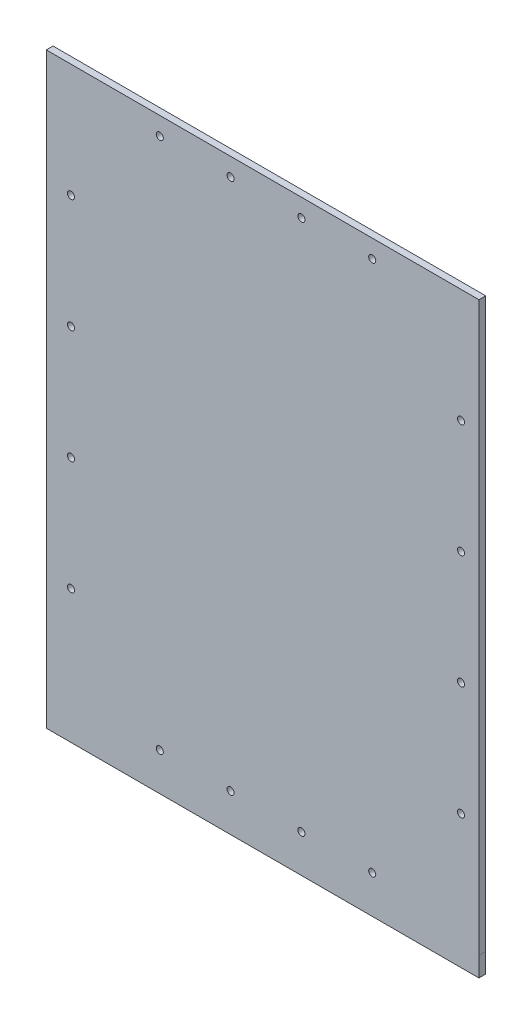
ISO-10303-21;
HEADER;
FILE_DESCRIPTION(('STEP AP214'),'2;1');
FILE_NAME('part.step','',(''),(''),'','','');
FILE_SCHEMA(('AUTOMOTIVE_DESIGN { 1 0 10303 214 1 1 1 1 }'));
ENDSEC;
DATA;
#1=APPLICATION_CONTEXT('core data for automotive mechanical design processes');
#2=APPLICATION_PROTOCOL_DEFINITION('international standard','automotive_design',2000,#1);
#3=PRODUCT_CONTEXT('',#1,'mechanical');
#4=PRODUCT('Part','Part','',(#3));
#5=PRODUCT_RELATED_PRODUCT_CATEGORY('part','',(#4));
#6=PRODUCT_DEFINITION_FORMATION('','',#4);
#7=PRODUCT_DEFINITION_CONTEXT('part definition',#1,'design');
#8=PRODUCT_DEFINITION('design','',#6,#7);
#9=PRODUCT_DEFINITION_SHAPE('','',#8);
#10=(LENGTH_UNIT() NAMED_UNIT(*) SI_UNIT(.MILLI.,.METRE.));
#11=(NAMED_UNIT(*) PLANE_ANGLE_UNIT() SI_UNIT($,.RADIAN.));
#12=(NAMED_UNIT(*) SI_UNIT($,.STERADIAN.) SOLID_ANGLE_UNIT());
#13=UNCERTAINTY_MEASURE_WITH_UNIT(LENGTH_MEASURE(1.E-05),#10,'distance_accuracy_value','');
#14=(GEOMETRIC_REPRESENTATION_CONTEXT(3) GLOBAL_UNCERTAINTY_ASSIGNED_CONTEXT((#13)) GLOBAL_UNIT_ASSIGNED_CONTEXT((#10,
#11,#12)) REPRESENTATION_CONTEXT('',''));
#15=CARTESIAN_POINT('',(0.,0.,0.));
#16=DIRECTION('',(0.,0.,1.));
#17=DIRECTION('',(1.,0.,0.));
#18=AXIS2_PLACEMENT_3D('',#15,#16,#17);
#19=CARTESIAN_POINT('',(-152.775,198.025,-0.00999999999999959));
#20=DIRECTION('',(0.,-1.,0.));
#21=DIRECTION('',(0.,0.,-1.));
#22=AXIS2_PLACEMENT_3D('',#19,#20,#21);
#23=PLANE('',#22);
#24=DIRECTION('',(0.,0.,-1.));
#25=VECTOR('',#24,1.);
#26=CARTESIAN_POINT('',(-152.775,198.025,4.75));
#27=LINE('',#26,#25);
#28=CARTESIAN_POINT('',(-152.775,198.025,4.75));
#29=VERTEX_POINT('',#28);
#30=CARTESIAN_POINT('',(-152.775,198.025,0.));
#31=VERTEX_POINT('',#30);
#32=EDGE_CURVE('E41',#29,#31,#27,.T.);
#33=ORIENTED_EDGE('',*,*,#32,.F.);
#34=DIRECTION('',(1.,0.,0.));
#35=VECTOR('',#34,1.);
#36=CARTESIAN_POINT('',(0.,198.025,4.75));
#37=LINE('',#36,#35);
#38=CARTESIAN_POINT('',(152.775,198.025,4.75));
#39=VERTEX_POINT('',#38);
#40=EDGE_CURVE('E11',#29,#39,#37,.T.);
#41=ORIENTED_EDGE('',*,*,#40,.T.);
#42=DIRECTION('',(0.,0.,1.));
#43=VECTOR('',#42,1.);
#44=CARTESIAN_POINT('',(152.775,198.025,-0.00999999999999959));
#45=LINE('',#44,#43);
#46=CARTESIAN_POINT('',(152.775,198.025,0.));
#47=VERTEX_POINT('',#46);
#48=EDGE_CURVE('E36',#47,#39,#45,.T.);
#49=ORIENTED_EDGE('',*,*,#48,.F.);
#50=DIRECTION('',(1.,0.,0.));
#51=VECTOR('',#50,1.);
#52=CARTESIAN_POINT('',(0.,198.025,0.));
#53=LINE('',#52,#51);
#54=EDGE_CURVE('E202',#31,#47,#53,.T.);
#55=ORIENTED_EDGE('',*,*,#54,.F.);
#56=EDGE_LOOP('',(#33,#41,#49,#55));
#57=FACE_BOUND('',#56,.T.);
#58=ADVANCED_FACE('F33',(#57),#23,.F.);
#59=CARTESIAN_POINT('',(152.775,-202.775,4.75));
#60=DIRECTION('',(0.,1.,0.));
#61=DIRECTION('',(-1.,0.,0.));
#62=AXIS2_PLACEMENT_3D('',#59,#60,#61);
#63=PLANE('',#62);
#64=DIRECTION('',(1.,0.,0.));
#65=VECTOR('',#64,1.);
#66=CARTESIAN_POINT('',(152.775,-202.775,4.75));
#67=LINE('',#66,#65);
#68=CARTESIAN_POINT('',(152.725,-202.775,4.75));
#69=VERTEX_POINT('',#68);
#70=CARTESIAN_POINT('',(152.775,-202.775,4.75));
#71=VERTEX_POINT('',#70);
#72=EDGE_CURVE('E95',#69,#71,#67,.T.);
#73=ORIENTED_EDGE('',*,*,#72,.F.);
#74=DIRECTION('',(0.,0.,-1.));
#75=VECTOR('',#74,1.);
#76=CARTESIAN_POINT('',(152.725,-202.775,4.75));
#77=LINE('',#76,#75);
#78=CARTESIAN_POINT('',(152.725,-202.775,0.));
#79=VERTEX_POINT('',#78);
#80=EDGE_CURVE('E115',#69,#79,#77,.T.);
#81=ORIENTED_EDGE('',*,*,#80,.T.);
#82=DIRECTION('',(1.,0.,0.));
#83=VECTOR('',#82,1.);
#84=CARTESIAN_POINT('',(152.775,-202.775,0.));
#85=LINE('',#84,#83);
#86=CARTESIAN_POINT('',(152.775,-202.775,0.));
#87=VERTEX_POINT('',#86);
#88=EDGE_CURVE('E195',#79,#87,#85,.T.);
#89=ORIENTED_EDGE('',*,*,#88,.T.);
#90=DIRECTION('',(0.,0.,-1.));
#91=VECTOR('',#90,1.);
#92=CARTESIAN_POINT('',(152.775,-202.775,4.75));
#93=LINE('',#92,#91);
#94=EDGE_CURVE('E193',#71,#87,#93,.T.);
#95=ORIENTED_EDGE('',*,*,#94,.F.);
#96=EDGE_LOOP('',(#73,#81,#89,#95));
#97=FACE_BOUND('',#96,.T.);
#98=ADVANCED_FACE('F232',(#97),#63,.F.);
#99=CARTESIAN_POINT('',(152.775,-202.775,4.75));
#100=DIRECTION('',(-1.,0.,0.));
#101=DIRECTION('',(0.,0.,1.));
#102=AXIS2_PLACEMENT_3D('',#99,#100,#101);
#103=PLANE('',#102);
#104=DIRECTION('',(0.,1.,0.));
#105=VECTOR('',#104,1.);
#106=CARTESIAN_POINT('',(152.775,-202.775,0.));
#107=LINE('',#106,#105);
#108=EDGE_CURVE('E96',#87,#47,#107,.T.);
#109=ORIENTED_EDGE('',*,*,#108,.T.);
#110=ORIENTED_EDGE('',*,*,#48,.T.);
#111=DIRECTION('',(0.,1.,0.));
#112=VECTOR('',#111,1.);
#113=CARTESIAN_POINT('',(152.775,-202.775,4.75));
#114=LINE('',#113,#112);
#115=EDGE_CURVE('E191',#71,#39,#114,.T.);
#116=ORIENTED_EDGE('',*,*,#115,.F.);
#117=ORIENTED_EDGE('',*,*,#94,.T.);
#118=EDGE_LOOP('',(#109,#110,#116,#117));
#119=FACE_BOUND('',#118,.T.);
#120=ADVANCED_FACE('F226',(#119),#103,.F.);
#121=CARTESIAN_POINT('',(-152.775,-202.775,4.75));
#122=DIRECTION('',(1.,0.,0.));
#123=DIRECTION('',(0.,0.,-1.));
#124=AXIS2_PLACEMENT_3D('',#121,#122,#123);
#125=PLANE('',#124);
#126=DIRECTION('',(0.,-1.,0.));
#127=VECTOR('',#126,1.);
#128=CARTESIAN_POINT('',(-152.775,-202.775,4.75));
#129=LINE('',#128,#127);
#130=CARTESIAN_POINT('',(-152.775,-216.775,4.75));
#131=VERTEX_POINT('',#130);
#132=EDGE_CURVE('E86',#29,#131,#129,.T.);
#133=ORIENTED_EDGE('',*,*,#132,.F.);
#134=ORIENTED_EDGE('',*,*,#32,.T.);
#135=DIRECTION('',(0.,-1.,0.));
#136=VECTOR('',#135,1.);
#137=CARTESIAN_POINT('',(-152.775,-202.775,0.));
#138=LINE('',#137,#136);
#139=CARTESIAN_POINT('',(-152.775,-216.775,0.));
#140=VERTEX_POINT('',#139);
#141=EDGE_CURVE('E108',#31,#140,#138,.T.);
#142=ORIENTED_EDGE('',*,*,#141,.T.);
#143=DIRECTION('',(0.,0.,-1.));
#144=VECTOR('',#143,1.);
#145=CARTESIAN_POINT('',(-152.775,-216.775,4.75));
#146=LINE('',#145,#144);
#147=EDGE_CURVE('E101',#131,#140,#146,.T.);
#148=ORIENTED_EDGE('',*,*,#147,.F.);
#149=EDGE_LOOP('',(#133,#134,#142,#148));
#150=FACE_BOUND('',#149,.T.);
#151=ADVANCED_FACE('F106',(#150),#125,.F.);
#152=CARTESIAN_POINT('',(140.075,37.705,-5.25));
#153=DIRECTION('',(0.,0.,1.));
#154=DIRECTION('',(1.,0.,0.));
#155=AXIS2_PLACEMENT_3D('',#152,#153,#154);
#156=CYLINDRICAL_SURFACE('',#155,2.5);
#157=CARTESIAN_POINT('',(140.075,37.705,4.75));
#158=DIRECTION('',(0.,0.,1.));
#159=DIRECTION('',(1.,0.,0.));
#160=AXIS2_PLACEMENT_3D('',#157,#158,#159);
#161=CIRCLE('',#160,2.5);
#162=CARTESIAN_POINT('',(142.575,37.705,4.75));
#163=VERTEX_POINT('',#162);
#164=EDGE_CURVE('E179',#163,#163,#161,.T.);
#165=ORIENTED_EDGE('',*,*,#164,.T.);
#166=EDGE_LOOP('',(#165));
#167=FACE_BOUND('',#166,.T.);
#168=CARTESIAN_POINT('',(140.075,37.705,0.));
#169=DIRECTION('',(0.,0.,1.));
#170=DIRECTION('',(1.,0.,0.));
#171=AXIS2_PLACEMENT_3D('',#168,#169,#170);
#172=CIRCLE('',#171,2.5);
#173=CARTESIAN_POINT('',(142.575,37.705,0.));
#174=VERTEX_POINT('',#173);
#175=EDGE_CURVE('E188',#174,#174,#172,.T.);
#176=ORIENTED_EDGE('',*,*,#175,.F.);
#177=EDGE_LOOP('',(#176));
#178=FACE_BOUND('',#177,.T.);
#179=ADVANCED_FACE('F263',(#167,#178),#156,.F.);
#180=CARTESIAN_POINT('',(140.075,117.865,-5.25));
#181=DIRECTION('',(0.,0.,1.));
#182=DIRECTION('',(1.,0.,0.));
#183=AXIS2_PLACEMENT_3D('',#180,#181,#182);
#184=CYLINDRICAL_SURFACE('',#183,2.5);
#185=CARTESIAN_POINT('',(140.075,117.865,4.75));
#186=DIRECTION('',(0.,0.,1.));
#187=DIRECTION('',(1.,0.,0.));
#188=AXIS2_PLACEMENT_3D('',#185,#186,#187);
#189=CIRCLE('',#188,2.5);
#190=CARTESIAN_POINT('',(142.575,117.865,4.75));
#191=VERTEX_POINT('',#190);
#192=EDGE_CURVE('E176',#191,#191,#189,.T.);
#193=ORIENTED_EDGE('',*,*,#192,.T.);
#194=EDGE_LOOP('',(#193));
#195=FACE_BOUND('',#194,.T.);
#196=CARTESIAN_POINT('',(140.075,117.865,0.));
#197=DIRECTION('',(0.,0.,1.));
#198=DIRECTION('',(1.,0.,0.));
#199=AXIS2_PLACEMENT_3D('',#196,#197,#198);
#200=CIRCLE('',#199,2.5);
#201=CARTESIAN_POINT('',(142.575,117.865,0.));
#202=VERTEX_POINT('',#201);
#203=EDGE_CURVE('E205',#202,#202,#200,.T.);
#204=ORIENTED_EDGE('',*,*,#203,.F.);
#205=EDGE_LOOP('',(#204));
#206=FACE_BOUND('',#205,.T.);
#207=ADVANCED_FACE('F270',(#195,#206),#184,.F.);
#208=CARTESIAN_POINT('',(140.075,-42.455,-5.25));
#209=DIRECTION('',(0.,0.,1.));
#210=DIRECTION('',(1.,0.,0.));
#211=AXIS2_PLACEMENT_3D('',#208,#209,#210);
#212=CYLINDRICAL_SURFACE('',#211,2.5);
#213=CARTESIAN_POINT('',(140.075,-42.455,4.75));
#214=DIRECTION('',(0.,0.,1.));
#215=DIRECTION('',(1.,0.,0.));
#216=AXIS2_PLACEMENT_3D('',#213,#214,#215);
#217=CIRCLE('',#216,2.5);
#218=CARTESIAN_POINT('',(142.575,-42.455,4.75));
#219=VERTEX_POINT('',#218);
#220=EDGE_CURVE('E180',#219,#219,#217,.T.);
#221=ORIENTED_EDGE('',*,*,#220,.T.);
#222=EDGE_LOOP('',(#221));
#223=FACE_BOUND('',#222,.T.);
#224=CARTESIAN_POINT('',(140.075,-42.455,0.));
#225=DIRECTION('',(0.,0.,1.));
#226=DIRECTION('',(1.,0.,0.));
#227=AXIS2_PLACEMENT_3D('',#224,#225,#226);
#228=CIRCLE('',#227,2.5);
#229=CARTESIAN_POINT('',(142.575,-42.455,0.));
#230=VERTEX_POINT('',#229);
#231=EDGE_CURVE('E208',#230,#230,#228,.T.);
#232=ORIENTED_EDGE('',*,*,#231,.F.);
#233=EDGE_LOOP('',(#232));
#234=FACE_BOUND('',#233,.T.);
#235=ADVANCED_FACE('F277',(#223,#234),#212,.F.);
#236=CARTESIAN_POINT('',(140.075,-122.615,-5.25));
#237=DIRECTION('',(0.,0.,1.));
#238=DIRECTION('',(1.,0.,0.));
#239=AXIS2_PLACEMENT_3D('',#236,#237,#238);
#240=CYLINDRICAL_SURFACE('',#239,2.5);
#241=CARTESIAN_POINT('',(140.075,-122.615,4.75));
#242=DIRECTION('',(0.,0.,1.));
#243=DIRECTION('',(1.,0.,0.));
#244=AXIS2_PLACEMENT_3D('',#241,#242,#243);
#245=CIRCLE('',#244,2.5);
#246=CARTESIAN_POINT('',(142.575,-122.615,4.75));
#247=VERTEX_POINT('',#246);
#248=EDGE_CURVE('E183',#247,#247,#245,.T.);
#249=ORIENTED_EDGE('',*,*,#248,.T.);
#250=EDGE_LOOP('',(#249));
#251=FACE_BOUND('',#250,.T.);
#252=CARTESIAN_POINT('',(140.075,-122.615,0.));
#253=DIRECTION('',(0.,0.,1.));
#254=DIRECTION('',(1.,0.,0.));
#255=AXIS2_PLACEMENT_3D('',#252,#253,#254);
#256=CIRCLE('',#255,2.5);
#257=CARTESIAN_POINT('',(142.575,-122.615,0.));
#258=VERTEX_POINT('',#257);
#259=EDGE_CURVE('E196',#258,#258,#256,.T.);
#260=ORIENTED_EDGE('',*,*,#259,.F.);
#261=EDGE_LOOP('',(#260));
#262=FACE_BOUND('',#261,.T.);
#263=ADVANCED_FACE('F289',(#251,#262),#240,.F.);
#264=CARTESIAN_POINT('',(-135.325,117.865,-5.25));
#265=DIRECTION('',(0.,0.,1.));
#266=DIRECTION('',(1.,0.,0.));
#267=AXIS2_PLACEMENT_3D('',#264,#265,#266);
#268=CYLINDRICAL_SURFACE('',#267,2.5);
#269=CARTESIAN_POINT('',(-135.325,117.865,4.75));
#270=DIRECTION('',(0.,0.,1.));
#271=DIRECTION('',(1.,0.,0.));
#272=AXIS2_PLACEMENT_3D('',#269,#270,#271);
#273=CIRCLE('',#272,2.5);
#274=CARTESIAN_POINT('',(-132.825,117.865,4.75));
#275=VERTEX_POINT('',#274);
#276=EDGE_CURVE('E163',#275,#275,#273,.T.);
#277=ORIENTED_EDGE('',*,*,#276,.T.);
#278=EDGE_LOOP('',(#277));
#279=FACE_BOUND('',#278,.T.);
#280=CARTESIAN_POINT('',(-135.325,117.865,0.));
#281=DIRECTION('',(0.,0.,1.));
#282=DIRECTION('',(1.,0.,0.));
#283=AXIS2_PLACEMENT_3D('',#280,#281,#282);
#284=CIRCLE('',#283,2.5);
#285=CARTESIAN_POINT('',(-132.825,117.865,0.));
#286=VERTEX_POINT('',#285);
#287=EDGE_CURVE('E167',#286,#286,#284,.T.);
#288=ORIENTED_EDGE('',*,*,#287,.F.);
#289=EDGE_LOOP('',(#288));
#290=FACE_BOUND('',#289,.T.);
#291=ADVANCED_FACE('F294',(#279,#290),#268,.F.);
#292=CARTESIAN_POINT('',(-135.325,37.705,-5.25));
#293=DIRECTION('',(0.,0.,1.));
#294=DIRECTION('',(1.,0.,0.));
#295=AXIS2_PLACEMENT_3D('',#292,#293,#294);
#296=CYLINDRICAL_SURFACE('',#295,2.5);
#297=CARTESIAN_POINT('',(-135.325,37.705,4.75));
#298=DIRECTION('',(0.,0.,1.));
#299=DIRECTION('',(1.,0.,0.));
#300=AXIS2_PLACEMENT_3D('',#297,#298,#299);
#301=CIRCLE('',#300,2.5);
#302=CARTESIAN_POINT('',(-132.825,37.705,4.75));
#303=VERTEX_POINT('',#302);
#304=EDGE_CURVE('E171',#303,#303,#301,.T.);
#305=ORIENTED_EDGE('',*,*,#304,.T.);
#306=EDGE_LOOP('',(#305));
#307=FACE_BOUND('',#306,.T.);
#308=CARTESIAN_POINT('',(-135.325,37.705,0.));
#309=DIRECTION('',(0.,0.,1.));
#310=DIRECTION('',(1.,0.,0.));
#311=AXIS2_PLACEMENT_3D('',#308,#309,#310);
#312=CIRCLE('',#311,2.5);
#313=CARTESIAN_POINT('',(-132.825,37.705,0.));
#314=VERTEX_POINT('',#313);
#315=EDGE_CURVE('E215',#314,#314,#312,.T.);
#316=ORIENTED_EDGE('',*,*,#315,.F.);
#317=EDGE_LOOP('',(#316));
#318=FACE_BOUND('',#317,.T.);
#319=ADVANCED_FACE('F302',(#307,#318),#296,.F.);
#320=CARTESIAN_POINT('',(-135.325,-42.455,-5.25));
#321=DIRECTION('',(0.,0.,1.));
#322=DIRECTION('',(1.,0.,0.));
#323=AXIS2_PLACEMENT_3D('',#320,#321,#322);
#324=CYLINDRICAL_SURFACE('',#323,2.5);
#325=CARTESIAN_POINT('',(-135.325,-42.455,4.75));
#326=DIRECTION('',(0.,0.,1.));
#327=DIRECTION('',(1.,0.,0.));
#328=AXIS2_PLACEMENT_3D('',#325,#326,#327);
#329=CIRCLE('',#328,2.5);
#330=CARTESIAN_POINT('',(-132.825,-42.455,4.75));
#331=VERTEX_POINT('',#330);
#332=EDGE_CURVE('E168',#331,#331,#329,.T.);
#333=ORIENTED_EDGE('',*,*,#332,.T.);
#334=EDGE_LOOP('',(#333));
#335=FACE_BOUND('',#334,.T.);
#336=CARTESIAN_POINT('',(-135.325,-42.455,0.));
#337=DIRECTION('',(0.,0.,1.));
#338=DIRECTION('',(1.,0.,0.));
#339=AXIS2_PLACEMENT_3D('',#336,#337,#338);
#340=CIRCLE('',#339,2.5);
#341=CARTESIAN_POINT('',(-132.825,-42.455,0.));
#342=VERTEX_POINT('',#341);
#343=EDGE_CURVE('E218',#342,#342,#340,.T.);
#344=ORIENTED_EDGE('',*,*,#343,.F.);
#345=EDGE_LOOP('',(#344));
#346=FACE_BOUND('',#345,.T.);
#347=ADVANCED_FACE('F322',(#335,#346),#324,.F.);
#348=CARTESIAN_POINT('',(-135.325,-122.615,-5.25));
#349=DIRECTION('',(0.,0.,1.));
#350=DIRECTION('',(1.,0.,0.));
#351=AXIS2_PLACEMENT_3D('',#348,#349,#350);
#352=CYLINDRICAL_SURFACE('',#351,2.5);
#353=CARTESIAN_POINT('',(-135.325,-122.615,4.75));
#354=DIRECTION('',(0.,0.,1.));
#355=DIRECTION('',(1.,0.,0.));
#356=AXIS2_PLACEMENT_3D('',#353,#354,#355);
#357=CIRCLE('',#356,2.5);
#358=CARTESIAN_POINT('',(-132.825,-122.615,4.75));
#359=VERTEX_POINT('',#358);
#360=EDGE_CURVE('E164',#359,#359,#357,.T.);
#361=ORIENTED_EDGE('',*,*,#360,.T.);
#362=EDGE_LOOP('',(#361));
#363=FACE_BOUND('',#362,.T.);
#364=CARTESIAN_POINT('',(-135.325,-122.615,0.));
#365=DIRECTION('',(0.,0.,1.));
#366=DIRECTION('',(1.,0.,0.));
#367=AXIS2_PLACEMENT_3D('',#364,#365,#366);
#368=CIRCLE('',#367,2.5);
#369=CARTESIAN_POINT('',(-132.825,-122.615,0.));
#370=VERTEX_POINT('',#369);
#371=EDGE_CURVE('E186',#370,#370,#368,.T.);
#372=ORIENTED_EDGE('',*,*,#371,.F.);
#373=EDGE_LOOP('',(#372));
#374=FACE_BOUND('',#373,.T.);
#375=ADVANCED_FACE('F333',(#363,#374),#352,.F.);
#376=CARTESIAN_POINT('',(-22.625,185.325,10.));
#377=DIRECTION('',(0.,0.,-1.));
#378=DIRECTION('',(-1.,0.,0.));
#379=AXIS2_PLACEMENT_3D('',#376,#377,#378);
#380=CYLINDRICAL_SURFACE('',#379,2.5);
#381=CARTESIAN_POINT('',(-22.625,185.325,4.75));
#382=DIRECTION('',(0.,0.,1.));
#383=DIRECTION('',(1.,0.,0.));
#384=AXIS2_PLACEMENT_3D('',#381,#382,#383);
#385=CIRCLE('',#384,2.5);
#386=CARTESIAN_POINT('',(-20.125,185.325,4.75));
#387=VERTEX_POINT('',#386);
#388=EDGE_CURVE('E151',#387,#387,#385,.T.);
#389=ORIENTED_EDGE('',*,*,#388,.T.);
#390=EDGE_LOOP('',(#389));
#391=FACE_BOUND('',#390,.T.);
#392=CARTESIAN_POINT('',(-22.625,185.325,0.));
#393=DIRECTION('',(0.,0.,-1.));
#394=DIRECTION('',(-1.,0.,0.));
#395=AXIS2_PLACEMENT_3D('',#392,#393,#394);
#396=CIRCLE('',#395,2.5);
#397=CARTESIAN_POINT('',(-25.125,185.325,0.));
#398=VERTEX_POINT('',#397);
#399=EDGE_CURVE('E146',#398,#398,#396,.T.);
#400=ORIENTED_EDGE('',*,*,#399,.T.);
#401=EDGE_LOOP('',(#400));
#402=FACE_BOUND('',#401,.T.);
#403=ADVANCED_FACE('F340',(#391,#402),#380,.F.);
#404=CARTESIAN_POINT('',(27.375,185.325,10.));
#405=DIRECTION('',(0.,0.,-1.));
#406=DIRECTION('',(-1.,0.,0.));
#407=AXIS2_PLACEMENT_3D('',#404,#405,#406);
#408=CYLINDRICAL_SURFACE('',#407,2.5);
#409=CARTESIAN_POINT('',(27.375,185.325,4.75));
#410=DIRECTION('',(0.,0.,1.));
#411=DIRECTION('',(1.,0.,0.));
#412=AXIS2_PLACEMENT_3D('',#409,#410,#411);
#413=CIRCLE('',#412,2.5);
#414=CARTESIAN_POINT('',(29.875,185.325,4.75));
#415=VERTEX_POINT('',#414);
#416=EDGE_CURVE('E154',#415,#415,#413,.T.);
#417=ORIENTED_EDGE('',*,*,#416,.T.);
#418=EDGE_LOOP('',(#417));
#419=FACE_BOUND('',#418,.T.);
#420=CARTESIAN_POINT('',(27.375,185.325,0.));
#421=DIRECTION('',(0.,0.,-1.));
#422=DIRECTION('',(-1.,0.,0.));
#423=AXIS2_PLACEMENT_3D('',#420,#421,#422);
#424=CIRCLE('',#423,2.5);
#425=CARTESIAN_POINT('',(24.875,185.325,0.));
#426=VERTEX_POINT('',#425);
#427=EDGE_CURVE('E139',#426,#426,#424,.T.);
#428=ORIENTED_EDGE('',*,*,#427,.T.);
#429=EDGE_LOOP('',(#428));
#430=FACE_BOUND('',#429,.T.);
#431=ADVANCED_FACE('F344',(#419,#430),#408,.F.);
#432=CARTESIAN_POINT('',(77.375,185.325,10.));
#433=DIRECTION('',(0.,0.,-1.));
#434=DIRECTION('',(-1.,0.,0.));
#435=AXIS2_PLACEMENT_3D('',#432,#433,#434);
#436=CYLINDRICAL_SURFACE('',#435,2.50000000000001);
#437=CARTESIAN_POINT('',(77.375,185.325,4.75));
#438=DIRECTION('',(0.,0.,1.));
#439=DIRECTION('',(1.,0.,0.));
#440=AXIS2_PLACEMENT_3D('',#437,#438,#439);
#441=CIRCLE('',#440,2.50000000000001);
#442=CARTESIAN_POINT('',(79.875,185.325,4.75));
#443=VERTEX_POINT('',#442);
#444=EDGE_CURVE('E157',#443,#443,#441,.T.);
#445=ORIENTED_EDGE('',*,*,#444,.T.);
#446=EDGE_LOOP('',(#445));
#447=FACE_BOUND('',#446,.T.);
#448=CARTESIAN_POINT('',(77.375,185.325,0.));
#449=DIRECTION('',(0.,0.,-1.));
#450=DIRECTION('',(-1.,0.,0.));
#451=AXIS2_PLACEMENT_3D('',#448,#449,#450);
#452=CIRCLE('',#451,2.50000000000001);
#453=CARTESIAN_POINT('',(74.8749999999999,185.325,0.));
#454=VERTEX_POINT('',#453);
#455=EDGE_CURVE('E142',#454,#454,#452,.T.);
#456=ORIENTED_EDGE('',*,*,#455,.T.);
#457=EDGE_LOOP('',(#456));
#458=FACE_BOUND('',#457,.T.);
#459=ADVANCED_FACE('F346',(#447,#458),#436,.F.);
#460=CARTESIAN_POINT('',(-72.6250000000001,185.325,10.));
#461=DIRECTION('',(0.,0.,-1.));
#462=DIRECTION('',(-1.,0.,0.));
#463=AXIS2_PLACEMENT_3D('',#460,#461,#462);
#464=CYLINDRICAL_SURFACE('',#463,2.5);
#465=CARTESIAN_POINT('',(-72.6250000000001,185.325,4.75));
#466=DIRECTION('',(0.,0.,1.));
#467=DIRECTION('',(1.,0.,0.));
#468=AXIS2_PLACEMENT_3D('',#465,#466,#467);
#469=CIRCLE('',#468,2.5);
#470=CARTESIAN_POINT('',(-70.125,185.325,4.75));
#471=VERTEX_POINT('',#470);
#472=EDGE_CURVE('E160',#471,#471,#469,.T.);
#473=ORIENTED_EDGE('',*,*,#472,.T.);
#474=EDGE_LOOP('',(#473));
#475=FACE_BOUND('',#474,.T.);
#476=CARTESIAN_POINT('',(-72.6250000000001,185.325,0.));
#477=DIRECTION('',(0.,0.,-1.));
#478=DIRECTION('',(-1.,0.,0.));
#479=AXIS2_PLACEMENT_3D('',#476,#477,#478);
#480=CIRCLE('',#479,2.5);
#481=CARTESIAN_POINT('',(-75.1250000000001,185.325,0.));
#482=VERTEX_POINT('',#481);
#483=EDGE_CURVE('E143',#482,#482,#480,.T.);
#484=ORIENTED_EDGE('',*,*,#483,.T.);
#485=EDGE_LOOP('',(#484));
#486=FACE_BOUND('',#485,.T.);
#487=ADVANCED_FACE('F349',(#475,#486),#464,.F.);
#488=CARTESIAN_POINT('',(-72.6250000000001,-190.075,10.));
#489=DIRECTION('',(0.,0.,-1.));
#490=DIRECTION('',(-1.,0.,0.));
#491=AXIS2_PLACEMENT_3D('',#488,#489,#490);
#492=CYLINDRICAL_SURFACE('',#491,2.5);
#493=CARTESIAN_POINT('',(-72.6250000000001,-190.075,4.75));
#494=DIRECTION('',(0.,0.,1.));
#495=DIRECTION('',(1.,0.,0.));
#496=AXIS2_PLACEMENT_3D('',#493,#494,#495);
#497=CIRCLE('',#496,2.5);
#498=CARTESIAN_POINT('',(-70.125,-190.075,4.75));
#499=VERTEX_POINT('',#498);
#500=EDGE_CURVE('E122',#499,#499,#497,.T.);
#501=ORIENTED_EDGE('',*,*,#500,.T.);
#502=EDGE_LOOP('',(#501));
#503=FACE_BOUND('',#502,.T.);
#504=CARTESIAN_POINT('',(-72.6250000000001,-190.075,0.));
#505=DIRECTION('',(0.,0.,-1.));
#506=DIRECTION('',(-1.,0.,0.));
#507=AXIS2_PLACEMENT_3D('',#504,#505,#506);
#508=CIRCLE('',#507,2.5);
#509=CARTESIAN_POINT('',(-75.1250000000001,-190.075,0.));
#510=VERTEX_POINT('',#509);
#511=EDGE_CURVE('E110',#510,#510,#508,.T.);
#512=ORIENTED_EDGE('',*,*,#511,.T.);
#513=EDGE_LOOP('',(#512));
#514=FACE_BOUND('',#513,.T.);
#515=ADVANCED_FACE('F353',(#503,#514),#492,.F.);
#516=CARTESIAN_POINT('',(-22.625,-190.075,10.));
#517=DIRECTION('',(0.,0.,-1.));
#518=DIRECTION('',(-1.,0.,0.));
#519=AXIS2_PLACEMENT_3D('',#516,#517,#518);
#520=CYLINDRICAL_SURFACE('',#519,2.5);
#521=CARTESIAN_POINT('',(-22.625,-190.075,4.75));
#522=DIRECTION('',(0.,0.,1.));
#523=DIRECTION('',(1.,0.,0.));
#524=AXIS2_PLACEMENT_3D('',#521,#522,#523);
#525=CIRCLE('',#524,2.5);
#526=CARTESIAN_POINT('',(-20.125,-190.075,4.75));
#527=VERTEX_POINT('',#526);
#528=EDGE_CURVE('E130',#527,#527,#525,.T.);
#529=ORIENTED_EDGE('',*,*,#528,.T.);
#530=EDGE_LOOP('',(#529));
#531=FACE_BOUND('',#530,.T.);
#532=CARTESIAN_POINT('',(-22.625,-190.075,0.));
#533=DIRECTION('',(0.,0.,-1.));
#534=DIRECTION('',(-1.,0.,0.));
#535=AXIS2_PLACEMENT_3D('',#532,#533,#534);
#536=CIRCLE('',#535,2.5);
#537=CARTESIAN_POINT('',(-25.125,-190.075,0.));
#538=VERTEX_POINT('',#537);
#539=EDGE_CURVE('E113',#538,#538,#536,.T.);
#540=ORIENTED_EDGE('',*,*,#539,.T.);
#541=EDGE_LOOP('',(#540));
#542=FACE_BOUND('',#541,.T.);
#543=ADVANCED_FACE('F360',(#531,#542),#520,.F.);
#544=CARTESIAN_POINT('',(27.375,-190.075,10.));
#545=DIRECTION('',(0.,0.,-1.));
#546=DIRECTION('',(-1.,0.,0.));
#547=AXIS2_PLACEMENT_3D('',#544,#545,#546);
#548=CYLINDRICAL_SURFACE('',#547,2.5);
#549=CARTESIAN_POINT('',(27.375,-190.075,4.75));
#550=DIRECTION('',(0.,0.,1.));
#551=DIRECTION('',(1.,0.,0.));
#552=AXIS2_PLACEMENT_3D('',#549,#550,#551);
#553=CIRCLE('',#552,2.5);
#554=CARTESIAN_POINT('',(29.875,-190.075,4.75));
#555=VERTEX_POINT('',#554);
#556=EDGE_CURVE('E133',#555,#555,#553,.T.);
#557=ORIENTED_EDGE('',*,*,#556,.T.);
#558=EDGE_LOOP('',(#557));
#559=FACE_BOUND('',#558,.T.);
#560=CARTESIAN_POINT('',(27.375,-190.075,0.));
#561=DIRECTION('',(0.,0.,-1.));
#562=DIRECTION('',(-1.,0.,0.));
#563=AXIS2_PLACEMENT_3D('',#560,#561,#562);
#564=CIRCLE('',#563,2.5);
#565=CARTESIAN_POINT('',(24.875,-190.075,0.));
#566=VERTEX_POINT('',#565);
#567=EDGE_CURVE('E123',#566,#566,#564,.T.);
#568=ORIENTED_EDGE('',*,*,#567,.T.);
#569=EDGE_LOOP('',(#568));
#570=FACE_BOUND('',#569,.T.);
#571=ADVANCED_FACE('F364',(#559,#570),#548,.F.);
#572=CARTESIAN_POINT('',(77.375,-190.075,10.));
#573=DIRECTION('',(0.,0.,-1.));
#574=DIRECTION('',(-1.,0.,0.));
#575=AXIS2_PLACEMENT_3D('',#572,#573,#574);
#576=CYLINDRICAL_SURFACE('',#575,2.50000000000001);
#577=CARTESIAN_POINT('',(77.375,-190.075,4.75));
#578=DIRECTION('',(0.,0.,1.));
#579=DIRECTION('',(1.,0.,0.));
#580=AXIS2_PLACEMENT_3D('',#577,#578,#579);
#581=CIRCLE('',#580,2.50000000000001);
#582=CARTESIAN_POINT('',(79.875,-190.075,4.75));
#583=VERTEX_POINT('',#582);
#584=EDGE_CURVE('E136',#583,#583,#581,.T.);
#585=ORIENTED_EDGE('',*,*,#584,.T.);
#586=EDGE_LOOP('',(#585));
#587=FACE_BOUND('',#586,.T.);
#588=CARTESIAN_POINT('',(77.375,-190.075,0.));
#589=DIRECTION('',(0.,0.,-1.));
#590=DIRECTION('',(-1.,0.,0.));
#591=AXIS2_PLACEMENT_3D('',#588,#589,#590);
#592=CIRCLE('',#591,2.50000000000001);
#593=CARTESIAN_POINT('',(74.8749999999999,-190.075,0.));
#594=VERTEX_POINT('',#593);
#595=EDGE_CURVE('E119',#594,#594,#592,.T.);
#596=ORIENTED_EDGE('',*,*,#595,.T.);
#597=EDGE_LOOP('',(#596));
#598=FACE_BOUND('',#597,.T.);
#599=ADVANCED_FACE('F259',(#587,#598),#576,.F.);
#600=CARTESIAN_POINT('',(0.,0.,0.));
#601=DIRECTION('',(0.,0.,1.));
#602=DIRECTION('',(1.,0.,0.));
#603=AXIS2_PLACEMENT_3D('',#600,#601,#602);
#604=PLANE('',#603);
#605=ORIENTED_EDGE('',*,*,#595,.F.);
#606=EDGE_LOOP('',(#605));
#607=FACE_BOUND('',#606,.T.);
#608=ORIENTED_EDGE('',*,*,#567,.F.);
#609=EDGE_LOOP('',(#608));
#610=FACE_BOUND('',#609,.T.);
#611=ORIENTED_EDGE('',*,*,#539,.F.);
#612=EDGE_LOOP('',(#611));
#613=FACE_BOUND('',#612,.T.);
#614=ORIENTED_EDGE('',*,*,#511,.F.);
#615=EDGE_LOOP('',(#614));
#616=FACE_BOUND('',#615,.T.);
#617=ORIENTED_EDGE('',*,*,#483,.F.);
#618=EDGE_LOOP('',(#617));
#619=FACE_BOUND('',#618,.T.);
#620=ORIENTED_EDGE('',*,*,#455,.F.);
#621=EDGE_LOOP('',(#620));
#622=FACE_BOUND('',#621,.T.);
#623=ORIENTED_EDGE('',*,*,#427,.F.);
#624=EDGE_LOOP('',(#623));
#625=FACE_BOUND('',#624,.T.);
#626=ORIENTED_EDGE('',*,*,#399,.F.);
#627=EDGE_LOOP('',(#626));
#628=FACE_BOUND('',#627,.T.);
#629=ORIENTED_EDGE('',*,*,#371,.T.);
#630=EDGE_LOOP('',(#629));
#631=FACE_BOUND('',#630,.T.);
#632=ORIENTED_EDGE('',*,*,#343,.T.);
#633=EDGE_LOOP('',(#632));
#634=FACE_BOUND('',#633,.T.);
#635=ORIENTED_EDGE('',*,*,#315,.T.);
#636=EDGE_LOOP('',(#635));
#637=FACE_BOUND('',#636,.T.);
#638=ORIENTED_EDGE('',*,*,#287,.T.);
#639=EDGE_LOOP('',(#638));
#640=FACE_BOUND('',#639,.T.);
#641=ORIENTED_EDGE('',*,*,#259,.T.);
#642=EDGE_LOOP('',(#641));
#643=FACE_BOUND('',#642,.T.);
#644=ORIENTED_EDGE('',*,*,#231,.T.);
#645=EDGE_LOOP('',(#644));
#646=FACE_BOUND('',#645,.T.);
#647=ORIENTED_EDGE('',*,*,#203,.T.);
#648=EDGE_LOOP('',(#647));
#649=FACE_BOUND('',#648,.T.);
#650=ORIENTED_EDGE('',*,*,#175,.T.);
#651=EDGE_LOOP('',(#650));
#652=FACE_BOUND('',#651,.T.);
#653=ORIENTED_EDGE('',*,*,#141,.F.);
#654=ORIENTED_EDGE('',*,*,#54,.T.);
#655=ORIENTED_EDGE('',*,*,#108,.F.);
#656=ORIENTED_EDGE('',*,*,#88,.F.);
#657=DIRECTION('',(0.,1.,0.));
#658=VECTOR('',#657,1.);
#659=CARTESIAN_POINT('',(152.725,-202.775,0.));
#660=LINE('',#659,#658);
#661=CARTESIAN_POINT('',(152.725,-216.775,0.));
#662=VERTEX_POINT('',#661);
#663=EDGE_CURVE('E49',#662,#79,#660,.T.);
#664=ORIENTED_EDGE('',*,*,#663,.F.);
#665=DIRECTION('',(1.,0.,0.));
#666=VECTOR('',#665,1.);
#667=CARTESIAN_POINT('',(-152.775,-216.775,0.));
#668=LINE('',#667,#666);
#669=EDGE_CURVE('E236',#140,#662,#668,.T.);
#670=ORIENTED_EDGE('',*,*,#669,.F.);
#671=EDGE_LOOP('',(#653,#654,#655,#656,#664,#670));
#672=FACE_BOUND('',#671,.T.);
#673=ADVANCED_FACE('F235',(#607,#610,#613,#616,#619,#622,#625,#628,#631,#634,#637,#640,#643,
#646,#649,#652,#672),#604,.F.);
#674=CARTESIAN_POINT('',(0.,0.,4.75));
#675=DIRECTION('',(0.,0.,1.));
#676=DIRECTION('',(1.,0.,0.));
#677=AXIS2_PLACEMENT_3D('',#674,#675,#676);
#678=PLANE('',#677);
#679=ORIENTED_EDGE('',*,*,#40,.F.);
#680=ORIENTED_EDGE('',*,*,#132,.T.);
#681=DIRECTION('',(1.,0.,0.));
#682=VECTOR('',#681,1.);
#683=CARTESIAN_POINT('',(-152.775,-216.775,4.75));
#684=LINE('',#683,#682);
#685=CARTESIAN_POINT('',(152.725,-216.775,4.75));
#686=VERTEX_POINT('',#685);
#687=EDGE_CURVE('E90',#131,#686,#684,.T.);
#688=ORIENTED_EDGE('',*,*,#687,.T.);
#689=DIRECTION('',(0.,1.,0.));
#690=VECTOR('',#689,1.);
#691=CARTESIAN_POINT('',(152.725,-202.775,4.75));
#692=LINE('',#691,#690);
#693=EDGE_CURVE('E104',#686,#69,#692,.T.);
#694=ORIENTED_EDGE('',*,*,#693,.T.);
#695=ORIENTED_EDGE('',*,*,#72,.T.);
#696=ORIENTED_EDGE('',*,*,#115,.T.);
#697=EDGE_LOOP('',(#679,#680,#688,#694,#695,#696));
#698=FACE_BOUND('',#697,.T.);
#699=ORIENTED_EDGE('',*,*,#584,.F.);
#700=EDGE_LOOP('',(#699));
#701=FACE_BOUND('',#700,.T.);
#702=ORIENTED_EDGE('',*,*,#556,.F.);
#703=EDGE_LOOP('',(#702));
#704=FACE_BOUND('',#703,.T.);
#705=ORIENTED_EDGE('',*,*,#528,.F.);
#706=EDGE_LOOP('',(#705));
#707=FACE_BOUND('',#706,.T.);
#708=ORIENTED_EDGE('',*,*,#500,.F.);
#709=EDGE_LOOP('',(#708));
#710=FACE_BOUND('',#709,.T.);
#711=ORIENTED_EDGE('',*,*,#472,.F.);
#712=EDGE_LOOP('',(#711));
#713=FACE_BOUND('',#712,.T.);
#714=ORIENTED_EDGE('',*,*,#444,.F.);
#715=EDGE_LOOP('',(#714));
#716=FACE_BOUND('',#715,.T.);
#717=ORIENTED_EDGE('',*,*,#416,.F.);
#718=EDGE_LOOP('',(#717));
#719=FACE_BOUND('',#718,.T.);
#720=ORIENTED_EDGE('',*,*,#388,.F.);
#721=EDGE_LOOP('',(#720));
#722=FACE_BOUND('',#721,.T.);
#723=ORIENTED_EDGE('',*,*,#360,.F.);
#724=EDGE_LOOP('',(#723));
#725=FACE_BOUND('',#724,.T.);
#726=ORIENTED_EDGE('',*,*,#332,.F.);
#727=EDGE_LOOP('',(#726));
#728=FACE_BOUND('',#727,.T.);
#729=ORIENTED_EDGE('',*,*,#304,.F.);
#730=EDGE_LOOP('',(#729));
#731=FACE_BOUND('',#730,.T.);
#732=ORIENTED_EDGE('',*,*,#276,.F.);
#733=EDGE_LOOP('',(#732));
#734=FACE_BOUND('',#733,.T.);
#735=ORIENTED_EDGE('',*,*,#248,.F.);
#736=EDGE_LOOP('',(#735));
#737=FACE_BOUND('',#736,.T.);
#738=ORIENTED_EDGE('',*,*,#220,.F.);
#739=EDGE_LOOP('',(#738));
#740=FACE_BOUND('',#739,.T.);
#741=ORIENTED_EDGE('',*,*,#192,.F.);
#742=EDGE_LOOP('',(#741));
#743=FACE_BOUND('',#742,.T.);
#744=ORIENTED_EDGE('',*,*,#164,.F.);
#745=EDGE_LOOP('',(#744));
#746=FACE_BOUND('',#745,.T.);
#747=ADVANCED_FACE('F88',(#698,#701,#704,#707,#710,#713,#716,#719,#722,#725,#728,#731,#734,#737,
#740,#743,#746),#678,.T.);
#748=CARTESIAN_POINT('',(-152.775,-216.775,4.75));
#749=DIRECTION('',(0.,1.,0.));
#750=DIRECTION('',(0.,0.,1.));
#751=AXIS2_PLACEMENT_3D('',#748,#749,#750);
#752=PLANE('',#751);
#753=ORIENTED_EDGE('',*,*,#669,.T.);
#754=DIRECTION('',(0.,0.,-1.));
#755=VECTOR('',#754,1.);
#756=CARTESIAN_POINT('',(152.725,-216.775,4.75));
#757=LINE('',#756,#755);
#758=EDGE_CURVE('E102',#686,#662,#757,.T.);
#759=ORIENTED_EDGE('',*,*,#758,.F.);
#760=ORIENTED_EDGE('',*,*,#687,.F.);
#761=ORIENTED_EDGE('',*,*,#147,.T.);
#762=EDGE_LOOP('',(#753,#759,#760,#761));
#763=FACE_BOUND('',#762,.T.);
#764=ADVANCED_FACE('F100',(#763),#752,.F.);
#765=CARTESIAN_POINT('',(152.725,-202.775,4.75));
#766=DIRECTION('',(-1.,0.,0.));
#767=DIRECTION('',(0.,0.,1.));
#768=AXIS2_PLACEMENT_3D('',#765,#766,#767);
#769=PLANE('',#768);
#770=ORIENTED_EDGE('',*,*,#663,.T.);
#771=ORIENTED_EDGE('',*,*,#80,.F.);
#772=ORIENTED_EDGE('',*,*,#693,.F.);
#773=ORIENTED_EDGE('',*,*,#758,.T.);
#774=EDGE_LOOP('',(#770,#771,#772,#773));
#775=FACE_BOUND('',#774,.T.);
#776=ADVANCED_FACE('F240',(#775),#769,.F.);
#777=CLOSED_SHELL('',(#58,#98,#120,#151,#179,#207,#235,#263,#291,#319,#347,#375,#403,#431,#459,
#487,#515,#543,#571,#599,#673,#747,#764,#776));
#778=MANIFOLD_SOLID_BREP('B2',#777);
#779=ADVANCED_BREP_SHAPE_REPRESENTATION('',(#18,#778),#14);
#780=SHAPE_DEFINITION_REPRESENTATION(#9,#779);
ENDSEC;
END-ISO-10303-21;
